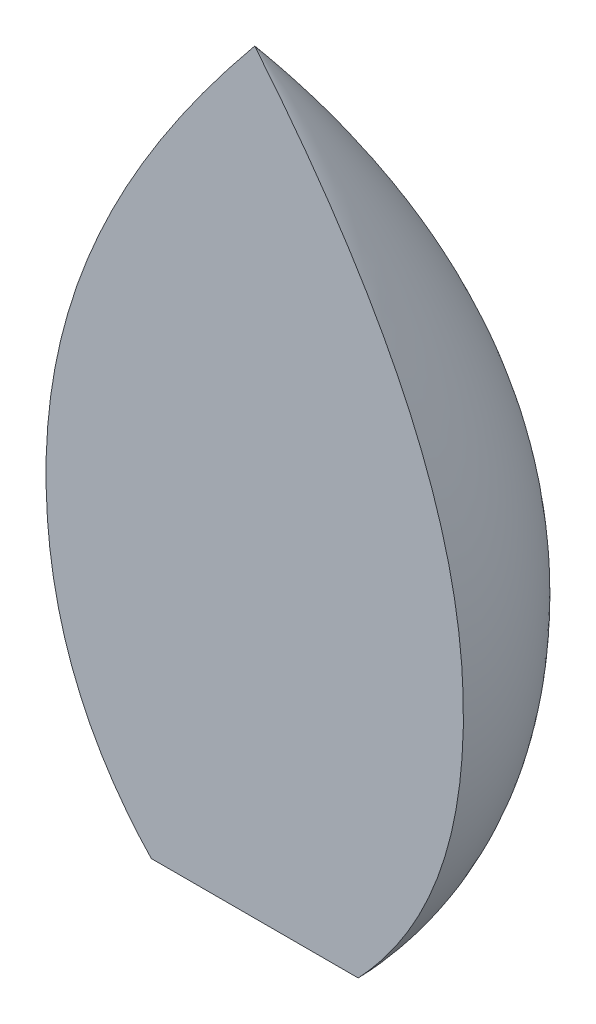
ISO-10303-21;
HEADER;
FILE_DESCRIPTION(('STEP AP214'),'2;1');
FILE_NAME('part.step','',(''),(''),'','','');
FILE_SCHEMA(('AUTOMOTIVE_DESIGN { 1 0 10303 214 1 1 1 1 }'));
ENDSEC;
DATA;
#1=APPLICATION_CONTEXT('core data for automotive mechanical design processes');
#2=APPLICATION_PROTOCOL_DEFINITION('international standard','automotive_design',2000,#1);
#3=PRODUCT_CONTEXT('',#1,'mechanical');
#4=PRODUCT('Part','Part','',(#3));
#5=PRODUCT_RELATED_PRODUCT_CATEGORY('part','',(#4));
#6=PRODUCT_DEFINITION_FORMATION('','',#4);
#7=PRODUCT_DEFINITION_CONTEXT('part definition',#1,'design');
#8=PRODUCT_DEFINITION('design','',#6,#7);
#9=PRODUCT_DEFINITION_SHAPE('','',#8);
#10=(LENGTH_UNIT() NAMED_UNIT(*) SI_UNIT(.MILLI.,.METRE.));
#11=(NAMED_UNIT(*) PLANE_ANGLE_UNIT() SI_UNIT($,.RADIAN.));
#12=(NAMED_UNIT(*) SI_UNIT($,.STERADIAN.) SOLID_ANGLE_UNIT());
#13=UNCERTAINTY_MEASURE_WITH_UNIT(LENGTH_MEASURE(1.E-05),#10,'distance_accuracy_value','');
#14=(GEOMETRIC_REPRESENTATION_CONTEXT(3) GLOBAL_UNCERTAINTY_ASSIGNED_CONTEXT((#13)) GLOBAL_UNIT_ASSIGNED_CONTEXT((#10,
#11,#12)) REPRESENTATION_CONTEXT('',''));
#15=CARTESIAN_POINT('',(0.,0.,0.));
#16=DIRECTION('',(0.,0.,1.));
#17=DIRECTION('',(1.,0.,0.));
#18=AXIS2_PLACEMENT_3D('',#15,#16,#17);
#19=CARTESIAN_POINT('',(0.,-23.,0.));
#20=DIRECTION('',(0.,-1.,0.));
#21=DIRECTION('',(0.,0.,-1.));
#22=AXIS2_PLACEMENT_3D('',#19,#20,#21);
#23=PLANE('',#22);
#24=CARTESIAN_POINT('',(0.,-23.0000000000001,0.));
#25=DIRECTION('',(0.,-1.,0.));
#26=DIRECTION('',(0.,0.,-1.));
#27=AXIS2_PLACEMENT_3D('',#24,#25,#26);
#28=CIRCLE('',#27,9.99999999999991);
#29=CARTESIAN_POINT('',(-9.99999999999991,-23.0000000000001,0.));
#30=VERTEX_POINT('',#29);
#31=CARTESIAN_POINT('',(9.99999999999991,-23.0000000000001,0.));
#32=VERTEX_POINT('',#31);
#33=EDGE_CURVE('E11',#30,#32,#28,.T.);
#34=ORIENTED_EDGE('',*,*,#33,.T.);
#35=DIRECTION('',(-1.,0.,0.));
#36=VECTOR('',#35,1.);
#37=CARTESIAN_POINT('',(0.,-23.,0.));
#38=LINE('',#37,#36);
#39=EDGE_CURVE('E56',#32,#30,#38,.T.);
#40=ORIENTED_EDGE('',*,*,#39,.T.);
#41=EDGE_LOOP('',(#34,#40));
#42=FACE_BOUND('',#41,.T.);
#43=ADVANCED_FACE('F35',(#42),#23,.T.);
#44=CARTESIAN_POINT('',(0.,50.,0.));
#45=CARTESIAN_POINT('',(-15.2884778103873,31.3933988591489,1.06758869948569E-13));
#46=CARTESIAN_POINT('',(-21.1052688804153,14.246209252337,1.47377304894474E-13));
#47=CARTESIAN_POINT('',(-19.2660182270643,-10.5503518815324,1.34533886227213E-13));
#48=CARTESIAN_POINT('',(-14.2498636084856,-18.4991527605796,0.));
#49=CARTESIAN_POINT('',(-9.99999999999991,-23.0000000000001,0.));
#50=B_SPLINE_CURVE_WITH_KNOTS('',3,(#44,#45,#46,#47,#48,#49),.UNSPECIFIED.,.F.,.F.,(4,1,1,4),
(0.,0.506987184328061,0.60698718432806,1.),.UNSPECIFIED.);
#51=CARTESIAN_POINT('',(0.,0.,0.));
#52=DIRECTION('',(0.,-1.,0.));
#53=AXIS1_PLACEMENT('',#51,#52);
#54=SURFACE_OF_REVOLUTION('',#50,#53);
#55=CARTESIAN_POINT('',(0.,50.,0.));
#56=CARTESIAN_POINT('',(15.2884778103873,31.3933988591489,0.));
#57=CARTESIAN_POINT('',(21.1052688804153,14.246209252337,0.));
#58=CARTESIAN_POINT('',(19.2660182270643,-10.5503518815324,0.));
#59=CARTESIAN_POINT('',(14.2498636084856,-18.4991527605796,0.));
#60=CARTESIAN_POINT('',(9.99999999999991,-23.0000000000001,0.));
#61=B_SPLINE_CURVE_WITH_KNOTS('',3,(#55,#56,#57,#58,#59,#60),.UNSPECIFIED.,.F.,.F.,(4,1,1,4),
(0.,0.506987184328061,0.60698718432806,1.),.UNSPECIFIED.);
#62=CARTESIAN_POINT('',(0.,50.,0.));
#63=VERTEX_POINT('',#62);
#64=EDGE_CURVE('E49',#63,#32,#61,.T.);
#65=ORIENTED_EDGE('',*,*,#64,.T.);
#66=ORIENTED_EDGE('',*,*,#33,.F.);
#67=EDGE_CURVE('E42',#63,#30,#50,.T.);
#68=ORIENTED_EDGE('',*,*,#67,.F.);
#69=EDGE_LOOP('',(#65,#66,#68));
#70=FACE_BOUND('',#69,.T.);
#71=ADVANCED_FACE('F60',(#70),#54,.T.);
#72=CARTESIAN_POINT('',(-20.1648743649262,4.74375595748265,1.40810565090512E-13));
#73=DIRECTION('',(0.,0.,-1.));
#74=DIRECTION('',(-1.,0.,0.));
#75=AXIS2_PLACEMENT_3D('',#72,#73,#74);
#76=PLANE('',#75);
#77=ORIENTED_EDGE('',*,*,#39,.F.);
#78=ORIENTED_EDGE('',*,*,#64,.F.);
#79=ORIENTED_EDGE('',*,*,#67,.T.);
#80=EDGE_LOOP('',(#77,#78,#79));
#81=FACE_BOUND('',#80,.T.);
#82=ADVANCED_FACE('F57',(#81),#76,.F.);
#83=CLOSED_SHELL('',(#43,#71,#82));
#84=MANIFOLD_SOLID_BREP('B2',#83);
#85=ADVANCED_BREP_SHAPE_REPRESENTATION('',(#18,#84),#14);
#86=SHAPE_DEFINITION_REPRESENTATION(#9,#85);
ENDSEC;
END-ISO-10303-21;
